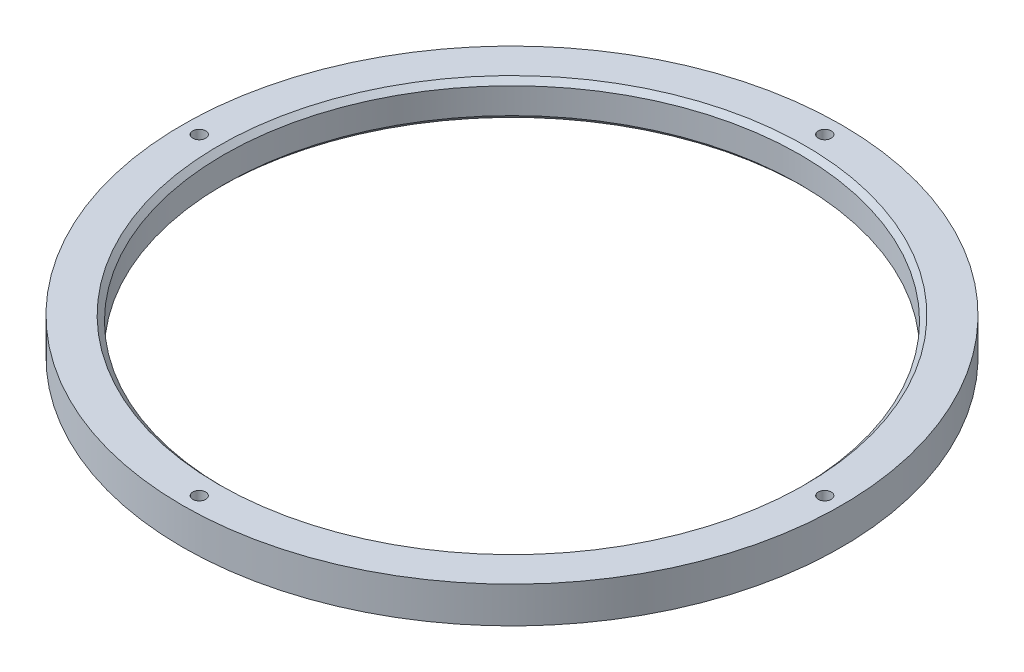
ISO-10303-21;
HEADER;
FILE_DESCRIPTION(('STEP AP214'),'2;1');
FILE_NAME('part.step','',(''),(''),'','','');
FILE_SCHEMA(('AUTOMOTIVE_DESIGN { 1 0 10303 214 1 1 1 1 }'));
ENDSEC;
DATA;
#1=APPLICATION_CONTEXT('core data for automotive mechanical design processes');
#2=APPLICATION_PROTOCOL_DEFINITION('international standard','automotive_design',2000,#1);
#3=PRODUCT_CONTEXT('',#1,'mechanical');
#4=PRODUCT('Part','Part','',(#3));
#5=PRODUCT_RELATED_PRODUCT_CATEGORY('part','',(#4));
#6=PRODUCT_DEFINITION_FORMATION('','',#4);
#7=PRODUCT_DEFINITION_CONTEXT('part definition',#1,'design');
#8=PRODUCT_DEFINITION('design','',#6,#7);
#9=PRODUCT_DEFINITION_SHAPE('','',#8);
#10=(LENGTH_UNIT() NAMED_UNIT(*) SI_UNIT(.MILLI.,.METRE.));
#11=(NAMED_UNIT(*) PLANE_ANGLE_UNIT() SI_UNIT($,.RADIAN.));
#12=(NAMED_UNIT(*) SI_UNIT($,.STERADIAN.) SOLID_ANGLE_UNIT());
#13=UNCERTAINTY_MEASURE_WITH_UNIT(LENGTH_MEASURE(1.E-05),#10,'distance_accuracy_value','');
#14=(GEOMETRIC_REPRESENTATION_CONTEXT(3) GLOBAL_UNCERTAINTY_ASSIGNED_CONTEXT((#13)) GLOBAL_UNIT_ASSIGNED_CONTEXT((#10,
#11,#12)) REPRESENTATION_CONTEXT('',''));
#15=CARTESIAN_POINT('',(0.,0.,0.));
#16=DIRECTION('',(0.,0.,1.));
#17=DIRECTION('',(1.,0.,0.));
#18=AXIS2_PLACEMENT_3D('',#15,#16,#17);
#19=CARTESIAN_POINT('',(0.,14.,0.));
#20=DIRECTION('',(0.,1.,0.));
#21=DIRECTION('',(0.,0.,1.));
#22=AXIS2_PLACEMENT_3D('',#19,#20,#21);
#23=PLANE('',#22);
#24=CARTESIAN_POINT('',(0.,14.,0.));
#25=DIRECTION('',(0.,1.,0.));
#26=DIRECTION('',(0.,0.,1.));
#27=AXIS2_PLACEMENT_3D('',#24,#25,#26);
#28=CIRCLE('',#27,113.5);
#29=CARTESIAN_POINT('',(0.,14.,113.5));
#30=VERTEX_POINT('',#29);
#31=EDGE_CURVE('E10',#30,#30,#28,.F.);
#32=ORIENTED_EDGE('',*,*,#31,.T.);
#33=EDGE_LOOP('',(#32));
#34=FACE_BOUND('',#33,.T.);
#35=CARTESIAN_POINT('',(6.83359900334872E-12,14.,121.));
#36=DIRECTION('',(0.,1.,0.));
#37=DIRECTION('',(0.,0.,1.));
#38=AXIS2_PLACEMENT_3D('',#35,#36,#37);
#39=CIRCLE('',#38,2.50000000000734);
#40=CARTESIAN_POINT('',(6.83359900334872E-12,14.,123.500000000007));
#41=VERTEX_POINT('',#40);
#42=EDGE_CURVE('E73',#41,#41,#39,.T.);
#43=ORIENTED_EDGE('',*,*,#42,.F.);
#44=EDGE_LOOP('',(#43));
#45=FACE_BOUND('',#44,.T.);
#46=CARTESIAN_POINT('',(0.,14.,-121.));
#47=DIRECTION('',(0.,1.,0.));
#48=DIRECTION('',(0.,0.,1.));
#49=AXIS2_PLACEMENT_3D('',#46,#47,#48);
#50=CIRCLE('',#49,2.5);
#51=CARTESIAN_POINT('',(0.,14.,-118.5));
#52=VERTEX_POINT('',#51);
#53=EDGE_CURVE('E61',#52,#52,#50,.T.);
#54=ORIENTED_EDGE('',*,*,#53,.F.);
#55=EDGE_LOOP('',(#54));
#56=FACE_BOUND('',#55,.T.);
#57=CARTESIAN_POINT('',(0.,14.,0.));
#58=DIRECTION('',(0.,1.,0.));
#59=DIRECTION('',(0.,0.,1.));
#60=AXIS2_PLACEMENT_3D('',#57,#58,#59);
#61=CIRCLE('',#60,127.5);
#62=CARTESIAN_POINT('',(0.,14.,127.5));
#63=VERTEX_POINT('',#62);
#64=EDGE_CURVE('E57',#63,#63,#61,.T.);
#65=ORIENTED_EDGE('',*,*,#64,.T.);
#66=EDGE_LOOP('',(#65));
#67=FACE_BOUND('',#66,.T.);
#68=CARTESIAN_POINT('',(121.000000000003,14.,-3.41679950167436E-12));
#69=DIRECTION('',(0.,1.,0.));
#70=DIRECTION('',(0.,0.,1.));
#71=AXIS2_PLACEMENT_3D('',#68,#69,#70);
#72=CIRCLE('',#71,2.50000000000268);
#73=CARTESIAN_POINT('',(121.000000000003,14.,2.49999999999926));
#74=VERTEX_POINT('',#73);
#75=EDGE_CURVE('E67',#74,#74,#72,.T.);
#76=ORIENTED_EDGE('',*,*,#75,.F.);
#77=EDGE_LOOP('',(#76));
#78=FACE_BOUND('',#77,.T.);
#79=CARTESIAN_POINT('',(-120.999999999997,14.,3.43161772794404E-12));
#80=DIRECTION('',(0.,1.,0.));
#81=DIRECTION('',(0.,0.,1.));
#82=AXIS2_PLACEMENT_3D('',#79,#80,#81);
#83=CIRCLE('',#82,2.50000000000549);
#84=CARTESIAN_POINT('',(-120.999999999997,14.,2.50000000000892));
#85=VERTEX_POINT('',#84);
#86=EDGE_CURVE('E79',#85,#85,#83,.T.);
#87=ORIENTED_EDGE('',*,*,#86,.F.);
#88=EDGE_LOOP('',(#87));
#89=FACE_BOUND('',#88,.T.);
#90=ADVANCED_FACE('F36',(#34,#45,#56,#67,#78,#89),#23,.T.);
#91=CARTESIAN_POINT('',(0.,0.,0.));
#92=DIRECTION('',(0.,1.,0.));
#93=DIRECTION('',(0.,0.,1.));
#94=AXIS2_PLACEMENT_3D('',#91,#92,#93);
#95=PLANE('',#94);
#96=CARTESIAN_POINT('',(0.,0.,0.));
#97=DIRECTION('',(0.,1.,0.));
#98=DIRECTION('',(0.,0.,1.));
#99=AXIS2_PLACEMENT_3D('',#96,#97,#98);
#100=CIRCLE('',#99,113.5);
#101=CARTESIAN_POINT('',(0.,0.,113.5));
#102=VERTEX_POINT('',#101);
#103=EDGE_CURVE('E52',#102,#102,#100,.T.);
#104=ORIENTED_EDGE('',*,*,#103,.T.);
#105=EDGE_LOOP('',(#104));
#106=FACE_BOUND('',#105,.T.);
#107=CARTESIAN_POINT('',(0.,0.,0.));
#108=DIRECTION('',(0.,1.,0.));
#109=DIRECTION('',(0.,0.,1.));
#110=AXIS2_PLACEMENT_3D('',#107,#108,#109);
#111=CIRCLE('',#110,127.5);
#112=CARTESIAN_POINT('',(0.,0.,127.5));
#113=VERTEX_POINT('',#112);
#114=EDGE_CURVE('E58',#113,#113,#111,.T.);
#115=ORIENTED_EDGE('',*,*,#114,.F.);
#116=EDGE_LOOP('',(#115));
#117=FACE_BOUND('',#116,.T.);
#118=CARTESIAN_POINT('',(0.,0.,-121.));
#119=DIRECTION('',(0.,1.,0.));
#120=DIRECTION('',(0.,0.,1.));
#121=AXIS2_PLACEMENT_3D('',#118,#119,#120);
#122=CIRCLE('',#121,2.5);
#123=CARTESIAN_POINT('',(0.,0.,-118.5));
#124=VERTEX_POINT('',#123);
#125=EDGE_CURVE('E64',#124,#124,#122,.T.);
#126=ORIENTED_EDGE('',*,*,#125,.T.);
#127=EDGE_LOOP('',(#126));
#128=FACE_BOUND('',#127,.T.);
#129=CARTESIAN_POINT('',(121.000000000003,0.,-3.41679950167436E-12));
#130=DIRECTION('',(0.,1.,0.));
#131=DIRECTION('',(0.,0.,1.));
#132=AXIS2_PLACEMENT_3D('',#129,#130,#131);
#133=CIRCLE('',#132,2.50000000000268);
#134=CARTESIAN_POINT('',(121.000000000003,0.,2.49999999999926));
#135=VERTEX_POINT('',#134);
#136=EDGE_CURVE('E70',#135,#135,#133,.T.);
#137=ORIENTED_EDGE('',*,*,#136,.T.);
#138=EDGE_LOOP('',(#137));
#139=FACE_BOUND('',#138,.T.);
#140=CARTESIAN_POINT('',(6.83359900334872E-12,0.,121.));
#141=DIRECTION('',(0.,1.,0.));
#142=DIRECTION('',(0.,0.,1.));
#143=AXIS2_PLACEMENT_3D('',#140,#141,#142);
#144=CIRCLE('',#143,2.50000000000734);
#145=CARTESIAN_POINT('',(6.83359900334872E-12,0.,123.500000000007));
#146=VERTEX_POINT('',#145);
#147=EDGE_CURVE('E76',#146,#146,#144,.T.);
#148=ORIENTED_EDGE('',*,*,#147,.T.);
#149=EDGE_LOOP('',(#148));
#150=FACE_BOUND('',#149,.T.);
#151=CARTESIAN_POINT('',(-120.999999999997,0.,3.43161772794404E-12));
#152=DIRECTION('',(0.,1.,0.));
#153=DIRECTION('',(0.,0.,1.));
#154=AXIS2_PLACEMENT_3D('',#151,#152,#153);
#155=CIRCLE('',#154,2.50000000000549);
#156=CARTESIAN_POINT('',(-120.999999999997,0.,2.50000000000892));
#157=VERTEX_POINT('',#156);
#158=EDGE_CURVE('E82',#157,#157,#155,.T.);
#159=ORIENTED_EDGE('',*,*,#158,.T.);
#160=EDGE_LOOP('',(#159));
#161=FACE_BOUND('',#160,.T.);
#162=ADVANCED_FACE('F92',(#106,#117,#128,#139,#150,#161),#95,.F.);
#163=CARTESIAN_POINT('',(0.,14.,0.));
#164=DIRECTION('',(0.,-1.,0.));
#165=DIRECTION('',(0.,0.,-1.));
#166=AXIS2_PLACEMENT_3D('',#163,#164,#165);
#167=CYLINDRICAL_SURFACE('',#166,127.5);
#168=ORIENTED_EDGE('',*,*,#64,.F.);
#169=EDGE_LOOP('',(#168));
#170=FACE_BOUND('',#169,.T.);
#171=ORIENTED_EDGE('',*,*,#114,.T.);
#172=EDGE_LOOP('',(#171));
#173=FACE_BOUND('',#172,.T.);
#174=ADVANCED_FACE('F97',(#170,#173),#167,.T.);
#175=CARTESIAN_POINT('',(0.,14.,0.));
#176=DIRECTION('',(0.,-1.,0.));
#177=DIRECTION('',(0.,0.,-1.));
#178=AXIS2_PLACEMENT_3D('',#175,#176,#177);
#179=CYLINDRICAL_SURFACE('',#178,111.5);
#180=CARTESIAN_POINT('',(0.,2.00000000000004,0.));
#181=DIRECTION('',(0.,1.,0.));
#182=DIRECTION('',(0.,0.,1.));
#183=AXIS2_PLACEMENT_3D('',#180,#181,#182);
#184=CIRCLE('',#183,111.5);
#185=CARTESIAN_POINT('',(0.,2.00000000000004,111.5));
#186=VERTEX_POINT('',#185);
#187=EDGE_CURVE('E44',#186,#186,#184,.F.);
#188=ORIENTED_EDGE('',*,*,#187,.T.);
#189=EDGE_LOOP('',(#188));
#190=FACE_BOUND('',#189,.T.);
#191=CARTESIAN_POINT('',(0.,11.9999999999999,0.));
#192=DIRECTION('',(0.,1.,0.));
#193=DIRECTION('',(0.,0.,1.));
#194=AXIS2_PLACEMENT_3D('',#191,#192,#193);
#195=CIRCLE('',#194,111.5);
#196=CARTESIAN_POINT('',(0.,11.9999999999999,111.5));
#197=VERTEX_POINT('',#196);
#198=EDGE_CURVE('E48',#197,#197,#195,.T.);
#199=ORIENTED_EDGE('',*,*,#198,.T.);
#200=EDGE_LOOP('',(#199));
#201=FACE_BOUND('',#200,.T.);
#202=ADVANCED_FACE('F102',(#190,#201),#179,.F.);
#203=CARTESIAN_POINT('',(0.,14.,-121.));
#204=DIRECTION('',(0.,-1.,0.));
#205=DIRECTION('',(0.,0.,-1.));
#206=AXIS2_PLACEMENT_3D('',#203,#204,#205);
#207=CYLINDRICAL_SURFACE('',#206,2.5);
#208=ORIENTED_EDGE('',*,*,#53,.T.);
#209=EDGE_LOOP('',(#208));
#210=FACE_BOUND('',#209,.T.);
#211=ORIENTED_EDGE('',*,*,#125,.F.);
#212=EDGE_LOOP('',(#211));
#213=FACE_BOUND('',#212,.T.);
#214=ADVANCED_FACE('F140',(#210,#213),#207,.F.);
#215=CARTESIAN_POINT('',(121.000000000003,14.,-3.41679950167436E-12));
#216=DIRECTION('',(0.,-1.,0.));
#217=DIRECTION('',(0.,0.,-1.));
#218=AXIS2_PLACEMENT_3D('',#215,#216,#217);
#219=CYLINDRICAL_SURFACE('',#218,2.50000000000268);
#220=ORIENTED_EDGE('',*,*,#75,.T.);
#221=EDGE_LOOP('',(#220));
#222=FACE_BOUND('',#221,.T.);
#223=ORIENTED_EDGE('',*,*,#136,.F.);
#224=EDGE_LOOP('',(#223));
#225=FACE_BOUND('',#224,.T.);
#226=ADVANCED_FACE('F134',(#222,#225),#219,.F.);
#227=CARTESIAN_POINT('',(6.83359900334872E-12,14.,121.));
#228=DIRECTION('',(0.,-1.,0.));
#229=DIRECTION('',(0.,0.,-1.));
#230=AXIS2_PLACEMENT_3D('',#227,#228,#229);
#231=CYLINDRICAL_SURFACE('',#230,2.50000000000734);
#232=ORIENTED_EDGE('',*,*,#42,.T.);
#233=EDGE_LOOP('',(#232));
#234=FACE_BOUND('',#233,.T.);
#235=ORIENTED_EDGE('',*,*,#147,.F.);
#236=EDGE_LOOP('',(#235));
#237=FACE_BOUND('',#236,.T.);
#238=ADVANCED_FACE('F118',(#234,#237),#231,.F.);
#239=CARTESIAN_POINT('',(-120.999999999997,14.,3.43161772794404E-12));
#240=DIRECTION('',(0.,-1.,0.));
#241=DIRECTION('',(0.,0.,-1.));
#242=AXIS2_PLACEMENT_3D('',#239,#240,#241);
#243=CYLINDRICAL_SURFACE('',#242,2.50000000000549);
#244=ORIENTED_EDGE('',*,*,#86,.T.);
#245=EDGE_LOOP('',(#244));
#246=FACE_BOUND('',#245,.T.);
#247=ORIENTED_EDGE('',*,*,#158,.F.);
#248=EDGE_LOOP('',(#247));
#249=FACE_BOUND('',#248,.T.);
#250=ADVANCED_FACE('F88',(#246,#249),#243,.F.);
#251=CARTESIAN_POINT('',(0.,0.,0.));
#252=DIRECTION('',(0.,-1.,0.));
#253=DIRECTION('',(0.,0.,-1.));
#254=AXIS2_PLACEMENT_3D('',#251,#252,#253);
#255=CONICAL_SURFACE('',#254,113.5,0.785398163397441);
#256=ORIENTED_EDGE('',*,*,#187,.F.);
#257=EDGE_LOOP('',(#256));
#258=FACE_BOUND('',#257,.T.);
#259=ORIENTED_EDGE('',*,*,#103,.F.);
#260=EDGE_LOOP('',(#259));
#261=FACE_BOUND('',#260,.T.);
#262=ADVANCED_FACE('F108',(#258,#261),#255,.F.);
#263=CARTESIAN_POINT('',(0.,11.9999999999999,0.));
#264=DIRECTION('',(0.,1.,0.));
#265=DIRECTION('',(0.,0.,1.));
#266=AXIS2_PLACEMENT_3D('',#263,#264,#265);
#267=CONICAL_SURFACE('',#266,111.5,0.785398163397445);
#268=ORIENTED_EDGE('',*,*,#31,.F.);
#269=EDGE_LOOP('',(#268));
#270=FACE_BOUND('',#269,.T.);
#271=ORIENTED_EDGE('',*,*,#198,.F.);
#272=EDGE_LOOP('',(#271));
#273=FACE_BOUND('',#272,.T.);
#274=ADVANCED_FACE('F39',(#270,#273),#267,.F.);
#275=CLOSED_SHELL('',(#90,#162,#174,#202,#214,#226,#238,#250,#262,#274));
#276=MANIFOLD_SOLID_BREP('B2',#275);
#277=ADVANCED_BREP_SHAPE_REPRESENTATION('',(#18,#276),#14);
#278=SHAPE_DEFINITION_REPRESENTATION(#9,#277);
ENDSEC;
END-ISO-10303-21;
